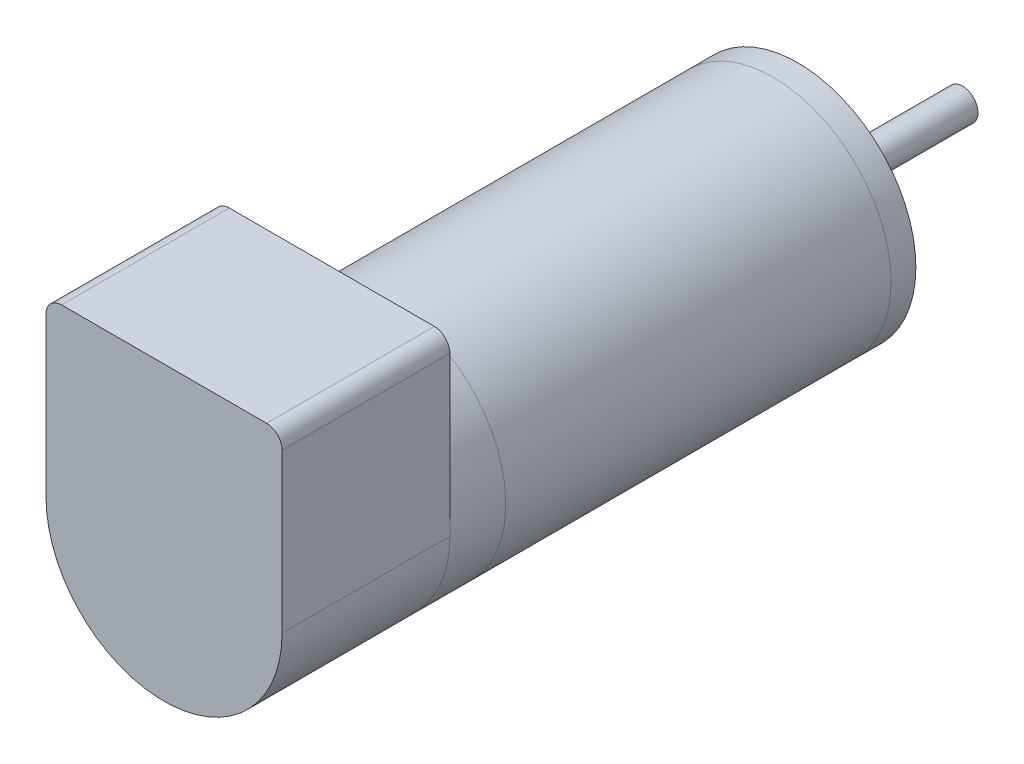
ISO-10303-21;
HEADER;
FILE_DESCRIPTION(('STEP AP214'),'2;1');
FILE_NAME('part.step','',(''),(''),'','','');
FILE_SCHEMA(('AUTOMOTIVE_DESIGN { 1 0 10303 214 1 1 1 1 }'));
ENDSEC;
DATA;
#1=APPLICATION_CONTEXT('core data for automotive mechanical design processes');
#2=APPLICATION_PROTOCOL_DEFINITION('international standard','automotive_design',2000,#1);
#3=PRODUCT_CONTEXT('',#1,'mechanical');
#4=PRODUCT('Part','Part','',(#3));
#5=PRODUCT_RELATED_PRODUCT_CATEGORY('part','',(#4));
#6=PRODUCT_DEFINITION_FORMATION('','',#4);
#7=PRODUCT_DEFINITION_CONTEXT('part definition',#1,'design');
#8=PRODUCT_DEFINITION('design','',#6,#7);
#9=PRODUCT_DEFINITION_SHAPE('','',#8);
#10=(LENGTH_UNIT() NAMED_UNIT(*) SI_UNIT(.MILLI.,.METRE.));
#11=(NAMED_UNIT(*) PLANE_ANGLE_UNIT() SI_UNIT($,.RADIAN.));
#12=(NAMED_UNIT(*) SI_UNIT($,.STERADIAN.) SOLID_ANGLE_UNIT());
#13=UNCERTAINTY_MEASURE_WITH_UNIT(LENGTH_MEASURE(1.E-05),#10,'distance_accuracy_value','');
#14=(GEOMETRIC_REPRESENTATION_CONTEXT(3) GLOBAL_UNCERTAINTY_ASSIGNED_CONTEXT((#13)) GLOBAL_UNIT_ASSIGNED_CONTEXT((#10,
#11,#12)) REPRESENTATION_CONTEXT('',''));
#15=CARTESIAN_POINT('',(0.,0.,0.));
#16=DIRECTION('',(0.,0.,1.));
#17=DIRECTION('',(1.,0.,0.));
#18=AXIS2_PLACEMENT_3D('',#15,#16,#17);
#19=CARTESIAN_POINT('',(0.,0.,0.));
#20=DIRECTION('',(0.,0.,1.));
#21=DIRECTION('',(1.,0.,0.));
#22=AXIS2_PLACEMENT_3D('',#19,#20,#21);
#23=CYLINDRICAL_SURFACE('',#22,19.);
#24=CARTESIAN_POINT('',(0.,0.,0.));
#25=DIRECTION('',(0.,0.,1.));
#26=DIRECTION('',(1.,0.,0.));
#27=AXIS2_PLACEMENT_3D('',#24,#25,#26);
#28=CIRCLE('',#27,19.);
#29=CARTESIAN_POINT('',(19.,0.,0.));
#30=VERTEX_POINT('',#29);
#31=CARTESIAN_POINT('',(0.,19.,0.));
#32=VERTEX_POINT('',#31);
#33=EDGE_CURVE('E151',#30,#32,#28,.T.);
#34=ORIENTED_EDGE('',*,*,#33,.F.);
#35=CARTESIAN_POINT('',(0.,0.,0.));
#36=DIRECTION('',(0.,0.,-1.));
#37=DIRECTION('',(-1.,0.,0.));
#38=AXIS2_PLACEMENT_3D('',#35,#36,#37);
#39=CIRCLE('',#38,19.);
#40=CARTESIAN_POINT('',(0.,-19.,0.));
#41=VERTEX_POINT('',#40);
#42=EDGE_CURVE('E128',#30,#41,#39,.T.);
#43=ORIENTED_EDGE('',*,*,#42,.T.);
#44=CARTESIAN_POINT('',(-19.,0.,0.));
#45=VERTEX_POINT('',#44);
#46=EDGE_CURVE('E158',#41,#45,#39,.T.);
#47=ORIENTED_EDGE('',*,*,#46,.T.);
#48=EDGE_CURVE('E150',#32,#45,#28,.T.);
#49=ORIENTED_EDGE('',*,*,#48,.F.);
#50=EDGE_LOOP('',(#34,#43,#47,#49));
#51=FACE_BOUND('',#50,.T.);
#52=CARTESIAN_POINT('',(0.,0.,-9.));
#53=DIRECTION('',(0.,0.,-1.));
#54=DIRECTION('',(0.,1.,0.));
#55=AXIS2_PLACEMENT_3D('',#52,#53,#54);
#56=CIRCLE('',#55,19.);
#57=CARTESIAN_POINT('',(0.,19.,-9.));
#58=VERTEX_POINT('',#57);
#59=CARTESIAN_POINT('',(0.,-19.,-9.00000000000001));
#60=VERTEX_POINT('',#59);
#61=EDGE_CURVE('E11',#58,#60,#56,.T.);
#62=ORIENTED_EDGE('',*,*,#61,.F.);
#63=EDGE_CURVE('E42',#60,#58,#56,.T.);
#64=ORIENTED_EDGE('',*,*,#63,.F.);
#65=EDGE_LOOP('',(#62,#64));
#66=FACE_BOUND('',#65,.T.);
#67=ADVANCED_FACE('F38',(#51,#66),#23,.T.);
#68=ORIENTED_EDGE('',*,*,#42,.F.);
#69=DIRECTION('',(0.,0.,-1.));
#70=VECTOR('',#69,1.);
#71=CARTESIAN_POINT('',(19.,0.,27.));
#72=LINE('',#71,#70);
#73=CARTESIAN_POINT('',(19.,0.,27.));
#74=VERTEX_POINT('',#73);
#75=EDGE_CURVE('E109',#74,#30,#72,.T.);
#76=ORIENTED_EDGE('',*,*,#75,.F.);
#77=CARTESIAN_POINT('',(0.,0.,27.));
#78=DIRECTION('',(0.,0.,1.));
#79=DIRECTION('',(1.,0.,0.));
#80=AXIS2_PLACEMENT_3D('',#77,#78,#79);
#81=CIRCLE('',#80,19.);
#82=CARTESIAN_POINT('',(-19.,0.,27.));
#83=VERTEX_POINT('',#82);
#84=EDGE_CURVE('E115',#83,#74,#81,.T.);
#85=ORIENTED_EDGE('',*,*,#84,.F.);
#86=DIRECTION('',(0.,0.,-1.));
#87=VECTOR('',#86,1.);
#88=CARTESIAN_POINT('',(-19.,0.,27.));
#89=LINE('',#88,#87);
#90=EDGE_CURVE('E205',#83,#45,#89,.T.);
#91=ORIENTED_EDGE('',*,*,#90,.T.);
#92=ORIENTED_EDGE('',*,*,#46,.F.);
#93=EDGE_LOOP('',(#68,#76,#85,#91,#92));
#94=FACE_BOUND('',#93,.T.);
#95=ADVANCED_FACE('F126',(#94),#23,.T.);
#96=ORIENTED_EDGE('',*,*,#63,.T.);
#97=ORIENTED_EDGE('',*,*,#61,.T.);
#98=EDGE_LOOP('',(#96,#97));
#99=FACE_BOUND('',#98,.T.);
#100=CARTESIAN_POINT('',(0.,0.,-71.));
#101=DIRECTION('',(0.,0.,-1.));
#102=DIRECTION('',(-1.,0.,0.));
#103=AXIS2_PLACEMENT_3D('',#100,#101,#102);
#104=CIRCLE('',#103,19.);
#105=CARTESIAN_POINT('',(0.,19.,-71.));
#106=VERTEX_POINT('',#105);
#107=CARTESIAN_POINT('',(0.,-19.,-71.));
#108=VERTEX_POINT('',#107);
#109=EDGE_CURVE('E157',#106,#108,#104,.T.);
#110=ORIENTED_EDGE('',*,*,#109,.F.);
#111=EDGE_CURVE('E154',#108,#106,#104,.T.);
#112=ORIENTED_EDGE('',*,*,#111,.F.);
#113=EDGE_LOOP('',(#110,#112));
#114=FACE_BOUND('',#113,.T.);
#115=ADVANCED_FACE('F173',(#99,#114),#23,.T.);
#116=ORIENTED_EDGE('',*,*,#111,.T.);
#117=ORIENTED_EDGE('',*,*,#109,.T.);
#118=EDGE_LOOP('',(#116,#117));
#119=FACE_BOUND('',#118,.T.);
#120=CARTESIAN_POINT('',(0.,0.,-75.));
#121=DIRECTION('',(0.,0.,1.));
#122=DIRECTION('',(1.,0.,0.));
#123=AXIS2_PLACEMENT_3D('',#120,#121,#122);
#124=CIRCLE('',#123,19.);
#125=CARTESIAN_POINT('',(19.,0.,-75.));
#126=VERTEX_POINT('',#125);
#127=EDGE_CURVE('E147',#126,#126,#124,.T.);
#128=ORIENTED_EDGE('',*,*,#127,.T.);
#129=EDGE_LOOP('',(#128));
#130=FACE_BOUND('',#129,.T.);
#131=ADVANCED_FACE('F40',(#119,#130),#23,.T.);
#132=CARTESIAN_POINT('',(0.,19.,-75.));
#133=DIRECTION('',(0.,0.,1.));
#134=DIRECTION('',(1.,0.,0.));
#135=AXIS2_PLACEMENT_3D('',#132,#133,#134);
#136=PLANE('',#135);
#137=CARTESIAN_POINT('',(8.83883476483179,-8.83883476483189,-75.));
#138=DIRECTION('',(0.,0.,-1.));
#139=DIRECTION('',(-1.,0.,0.));
#140=AXIS2_PLACEMENT_3D('',#137,#138,#139);
#141=CIRCLE('',#140,1.50000000000011);
#142=CARTESIAN_POINT('',(7.33883476483168,-8.83883476483189,-75.));
#143=VERTEX_POINT('',#142);
#144=EDGE_CURVE('E235',#143,#143,#141,.T.);
#145=ORIENTED_EDGE('',*,*,#144,.F.);
#146=EDGE_LOOP('',(#145));
#147=FACE_BOUND('',#146,.T.);
#148=CARTESIAN_POINT('',(-8.83883476483189,-8.83883476483179,-75.));
#149=DIRECTION('',(0.,0.,-1.));
#150=DIRECTION('',(-1.,0.,0.));
#151=AXIS2_PLACEMENT_3D('',#148,#149,#150);
#152=CIRCLE('',#151,1.50000000000007);
#153=CARTESIAN_POINT('',(-10.338834764832,-8.83883476483179,-75.));
#154=VERTEX_POINT('',#153);
#155=EDGE_CURVE('E241',#154,#154,#152,.T.);
#156=ORIENTED_EDGE('',*,*,#155,.F.);
#157=EDGE_LOOP('',(#156));
#158=FACE_BOUND('',#157,.T.);
#159=CARTESIAN_POINT('',(-8.83883476483179,8.83883476483189,-75.));
#160=DIRECTION('',(0.,0.,-1.));
#161=DIRECTION('',(-1.,0.,0.));
#162=AXIS2_PLACEMENT_3D('',#159,#160,#161);
#163=CIRCLE('',#162,1.50000000000003);
#164=CARTESIAN_POINT('',(-10.3388347648318,8.83883476483189,-75.));
#165=VERTEX_POINT('',#164);
#166=EDGE_CURVE('E247',#165,#165,#163,.T.);
#167=ORIENTED_EDGE('',*,*,#166,.F.);
#168=EDGE_LOOP('',(#167));
#169=FACE_BOUND('',#168,.T.);
#170=CARTESIAN_POINT('',(8.83883476483189,8.83883476483179,-75.));
#171=DIRECTION('',(0.,0.,-1.));
#172=DIRECTION('',(-1.,0.,0.));
#173=AXIS2_PLACEMENT_3D('',#170,#171,#172);
#174=CIRCLE('',#173,1.5);
#175=CARTESIAN_POINT('',(7.3388347648319,8.83883476483179,-75.));
#176=VERTEX_POINT('',#175);
#177=EDGE_CURVE('E195',#176,#176,#174,.T.);
#178=ORIENTED_EDGE('',*,*,#177,.F.);
#179=EDGE_LOOP('',(#178));
#180=FACE_BOUND('',#179,.T.);
#181=ORIENTED_EDGE('',*,*,#127,.F.);
#182=EDGE_LOOP('',(#181));
#183=FACE_BOUND('',#182,.T.);
#184=CARTESIAN_POINT('',(0.,0.,-75.));
#185=DIRECTION('',(0.,0.,1.));
#186=DIRECTION('',(1.,0.,0.));
#187=AXIS2_PLACEMENT_3D('',#184,#185,#186);
#188=CIRCLE('',#187,6.25);
#189=CARTESIAN_POINT('',(6.25,0.,-75.));
#190=VERTEX_POINT('',#189);
#191=EDGE_CURVE('E144',#190,#190,#188,.T.);
#192=ORIENTED_EDGE('',*,*,#191,.T.);
#193=EDGE_LOOP('',(#192));
#194=FACE_BOUND('',#193,.T.);
#195=ADVANCED_FACE('F179',(#147,#158,#169,#180,#183,#194),#136,.F.);
#196=CARTESIAN_POINT('',(0.,0.,0.));
#197=DIRECTION('',(0.,0.,1.));
#198=DIRECTION('',(1.,0.,0.));
#199=AXIS2_PLACEMENT_3D('',#196,#197,#198);
#200=CYLINDRICAL_SURFACE('',#199,6.25);
#201=ORIENTED_EDGE('',*,*,#191,.F.);
#202=EDGE_LOOP('',(#201));
#203=FACE_BOUND('',#202,.T.);
#204=CARTESIAN_POINT('',(0.,0.,-76.5));
#205=DIRECTION('',(0.,0.,1.));
#206=DIRECTION('',(1.,0.,0.));
#207=AXIS2_PLACEMENT_3D('',#204,#205,#206);
#208=CIRCLE('',#207,6.25);
#209=CARTESIAN_POINT('',(6.25,0.,-76.5));
#210=VERTEX_POINT('',#209);
#211=EDGE_CURVE('E141',#210,#210,#208,.T.);
#212=ORIENTED_EDGE('',*,*,#211,.T.);
#213=EDGE_LOOP('',(#212));
#214=FACE_BOUND('',#213,.T.);
#215=ADVANCED_FACE('F264',(#203,#214),#200,.T.);
#216=CARTESIAN_POINT('',(0.,6.25,-76.5));
#217=DIRECTION('',(0.,0.,1.));
#218=DIRECTION('',(1.,0.,0.));
#219=AXIS2_PLACEMENT_3D('',#216,#217,#218);
#220=PLANE('',#219);
#221=ORIENTED_EDGE('',*,*,#211,.F.);
#222=EDGE_LOOP('',(#221));
#223=FACE_BOUND('',#222,.T.);
#224=CARTESIAN_POINT('',(0.,0.,-76.5));
#225=DIRECTION('',(0.,0.,1.));
#226=DIRECTION('',(1.,0.,0.));
#227=AXIS2_PLACEMENT_3D('',#224,#225,#226);
#228=CIRCLE('',#227,2.5);
#229=CARTESIAN_POINT('',(2.5,0.,-76.5));
#230=VERTEX_POINT('',#229);
#231=EDGE_CURVE('E133',#230,#230,#228,.T.);
#232=ORIENTED_EDGE('',*,*,#231,.T.);
#233=EDGE_LOOP('',(#232));
#234=FACE_BOUND('',#233,.T.);
#235=ADVANCED_FACE('F274',(#223,#234),#220,.F.);
#236=CARTESIAN_POINT('',(0.,0.,0.));
#237=DIRECTION('',(0.,0.,1.));
#238=DIRECTION('',(1.,0.,0.));
#239=AXIS2_PLACEMENT_3D('',#236,#237,#238);
#240=CYLINDRICAL_SURFACE('',#239,2.5);
#241=ORIENTED_EDGE('',*,*,#231,.F.);
#242=EDGE_LOOP('',(#241));
#243=FACE_BOUND('',#242,.T.);
#244=CARTESIAN_POINT('',(0.,0.,-101.5));
#245=DIRECTION('',(0.,0.,1.));
#246=DIRECTION('',(1.,0.,0.));
#247=AXIS2_PLACEMENT_3D('',#244,#245,#246);
#248=CIRCLE('',#247,2.5);
#249=CARTESIAN_POINT('',(2.5,0.,-101.5));
#250=VERTEX_POINT('',#249);
#251=EDGE_CURVE('E130',#250,#250,#248,.T.);
#252=ORIENTED_EDGE('',*,*,#251,.T.);
#253=EDGE_LOOP('',(#252));
#254=FACE_BOUND('',#253,.T.);
#255=ADVANCED_FACE('F280',(#243,#254),#240,.T.);
#256=CARTESIAN_POINT('',(0.,2.5,-101.5));
#257=DIRECTION('',(0.,0.,1.));
#258=DIRECTION('',(1.,0.,0.));
#259=AXIS2_PLACEMENT_3D('',#256,#257,#258);
#260=PLANE('',#259);
#261=ORIENTED_EDGE('',*,*,#251,.F.);
#262=EDGE_LOOP('',(#261));
#263=FACE_BOUND('',#262,.T.);
#264=ADVANCED_FACE('F286',(#263),#260,.F.);
#265=CARTESIAN_POINT('',(0.,0.,0.));
#266=DIRECTION('',(0.,0.,1.));
#267=DIRECTION('',(1.,0.,0.));
#268=AXIS2_PLACEMENT_3D('',#265,#266,#267);
#269=PLANE('',#268);
#270=DIRECTION('',(0.,1.,0.));
#271=VECTOR('',#270,1.);
#272=CARTESIAN_POINT('',(19.,25.5,0.));
#273=LINE('',#272,#271);
#274=CARTESIAN_POINT('',(19.,25.5,0.));
#275=VERTEX_POINT('',#274);
#276=EDGE_CURVE('E186',#30,#275,#273,.T.);
#277=ORIENTED_EDGE('',*,*,#276,.F.);
#278=ORIENTED_EDGE('',*,*,#33,.T.);
#279=ORIENTED_EDGE('',*,*,#48,.T.);
#280=DIRECTION('',(0.,-1.,0.));
#281=VECTOR('',#280,1.);
#282=CARTESIAN_POINT('',(-19.,0.,0.));
#283=LINE('',#282,#281);
#284=CARTESIAN_POINT('',(-19.,25.5,0.));
#285=VERTEX_POINT('',#284);
#286=EDGE_CURVE('E124',#285,#45,#283,.T.);
#287=ORIENTED_EDGE('',*,*,#286,.F.);
#288=CARTESIAN_POINT('',(-16.5,25.5,0.));
#289=DIRECTION('',(0.,0.,1.));
#290=DIRECTION('',(-1.,0.,0.));
#291=AXIS2_PLACEMENT_3D('',#288,#289,#290);
#292=CIRCLE('',#291,2.5);
#293=CARTESIAN_POINT('',(-16.5,28.,0.));
#294=VERTEX_POINT('',#293);
#295=EDGE_CURVE('E201',#294,#285,#292,.T.);
#296=ORIENTED_EDGE('',*,*,#295,.F.);
#297=DIRECTION('',(-1.,0.,0.));
#298=VECTOR('',#297,1.);
#299=CARTESIAN_POINT('',(-16.5,28.,0.));
#300=LINE('',#299,#298);
#301=CARTESIAN_POINT('',(16.5,28.,0.));
#302=VERTEX_POINT('',#301);
#303=EDGE_CURVE('E192',#302,#294,#300,.T.);
#304=ORIENTED_EDGE('',*,*,#303,.F.);
#305=CARTESIAN_POINT('',(16.5,25.5,0.));
#306=DIRECTION('',(0.,0.,1.));
#307=DIRECTION('',(1.,0.,0.));
#308=AXIS2_PLACEMENT_3D('',#305,#306,#307);
#309=CIRCLE('',#308,2.5);
#310=EDGE_CURVE('E189',#275,#302,#309,.T.);
#311=ORIENTED_EDGE('',*,*,#310,.F.);
#312=EDGE_LOOP('',(#277,#278,#279,#287,#296,#304,#311));
#313=FACE_BOUND('',#312,.T.);
#314=ADVANCED_FACE('F187',(#313),#269,.F.);
#315=CARTESIAN_POINT('',(19.,25.5,27.));
#316=DIRECTION('',(-1.,0.,0.));
#317=DIRECTION('',(0.,0.,1.));
#318=AXIS2_PLACEMENT_3D('',#315,#316,#317);
#319=PLANE('',#318);
#320=ORIENTED_EDGE('',*,*,#276,.T.);
#321=DIRECTION('',(0.,0.,-1.));
#322=VECTOR('',#321,1.);
#323=CARTESIAN_POINT('',(19.,25.5,27.));
#324=LINE('',#323,#322);
#325=CARTESIAN_POINT('',(19.,25.5,27.));
#326=VERTEX_POINT('',#325);
#327=EDGE_CURVE('E111',#326,#275,#324,.T.);
#328=ORIENTED_EDGE('',*,*,#327,.F.);
#329=DIRECTION('',(0.,1.,0.));
#330=VECTOR('',#329,1.);
#331=CARTESIAN_POINT('',(19.,25.5,27.));
#332=LINE('',#331,#330);
#333=EDGE_CURVE('E105',#74,#326,#332,.T.);
#334=ORIENTED_EDGE('',*,*,#333,.F.);
#335=ORIENTED_EDGE('',*,*,#75,.T.);
#336=EDGE_LOOP('',(#320,#328,#334,#335));
#337=FACE_BOUND('',#336,.T.);
#338=ADVANCED_FACE('F107',(#337),#319,.F.);
#339=CARTESIAN_POINT('',(16.5,25.5,27.));
#340=DIRECTION('',(0.,0.,-1.));
#341=DIRECTION('',(-1.,0.,0.));
#342=AXIS2_PLACEMENT_3D('',#339,#340,#341);
#343=CYLINDRICAL_SURFACE('',#342,2.5);
#344=ORIENTED_EDGE('',*,*,#310,.T.);
#345=DIRECTION('',(0.,0.,-1.));
#346=VECTOR('',#345,1.);
#347=CARTESIAN_POINT('',(16.5,28.,27.));
#348=LINE('',#347,#346);
#349=CARTESIAN_POINT('',(16.5,28.,27.));
#350=VERTEX_POINT('',#349);
#351=EDGE_CURVE('E135',#350,#302,#348,.T.);
#352=ORIENTED_EDGE('',*,*,#351,.F.);
#353=CARTESIAN_POINT('',(16.5,25.5,27.));
#354=DIRECTION('',(0.,0.,1.));
#355=DIRECTION('',(1.,0.,0.));
#356=AXIS2_PLACEMENT_3D('',#353,#354,#355);
#357=CIRCLE('',#356,2.5);
#358=EDGE_CURVE('E114',#326,#350,#357,.T.);
#359=ORIENTED_EDGE('',*,*,#358,.F.);
#360=ORIENTED_EDGE('',*,*,#327,.T.);
#361=EDGE_LOOP('',(#344,#352,#359,#360));
#362=FACE_BOUND('',#361,.T.);
#363=ADVANCED_FACE('F299',(#362),#343,.T.);
#364=CARTESIAN_POINT('',(-16.5,28.,27.));
#365=DIRECTION('',(0.,-1.,0.));
#366=DIRECTION('',(0.,0.,-1.));
#367=AXIS2_PLACEMENT_3D('',#364,#365,#366);
#368=PLANE('',#367);
#369=ORIENTED_EDGE('',*,*,#303,.T.);
#370=DIRECTION('',(0.,0.,-1.));
#371=VECTOR('',#370,1.);
#372=CARTESIAN_POINT('',(-16.5,28.,27.));
#373=LINE('',#372,#371);
#374=CARTESIAN_POINT('',(-16.5,28.,27.));
#375=VERTEX_POINT('',#374);
#376=EDGE_CURVE('E210',#375,#294,#373,.T.);
#377=ORIENTED_EDGE('',*,*,#376,.F.);
#378=DIRECTION('',(-1.,0.,0.));
#379=VECTOR('',#378,1.);
#380=CARTESIAN_POINT('',(-16.5,28.,27.));
#381=LINE('',#380,#379);
#382=EDGE_CURVE('E218',#350,#375,#381,.T.);
#383=ORIENTED_EDGE('',*,*,#382,.F.);
#384=ORIENTED_EDGE('',*,*,#351,.T.);
#385=EDGE_LOOP('',(#369,#377,#383,#384));
#386=FACE_BOUND('',#385,.T.);
#387=ADVANCED_FACE('F216',(#386),#368,.F.);
#388=CARTESIAN_POINT('',(-16.5,25.5,27.));
#389=DIRECTION('',(0.,0.,-1.));
#390=DIRECTION('',(-1.,0.,0.));
#391=AXIS2_PLACEMENT_3D('',#388,#389,#390);
#392=CYLINDRICAL_SURFACE('',#391,2.5);
#393=ORIENTED_EDGE('',*,*,#295,.T.);
#394=DIRECTION('',(0.,0.,-1.));
#395=VECTOR('',#394,1.);
#396=CARTESIAN_POINT('',(-19.,25.5,27.));
#397=LINE('',#396,#395);
#398=CARTESIAN_POINT('',(-19.,25.5,27.));
#399=VERTEX_POINT('',#398);
#400=EDGE_CURVE('E207',#399,#285,#397,.T.);
#401=ORIENTED_EDGE('',*,*,#400,.F.);
#402=CARTESIAN_POINT('',(-16.5,25.5,27.));
#403=DIRECTION('',(0.,0.,1.));
#404=DIRECTION('',(-1.,0.,0.));
#405=AXIS2_PLACEMENT_3D('',#402,#403,#404);
#406=CIRCLE('',#405,2.5);
#407=EDGE_CURVE('E228',#375,#399,#406,.T.);
#408=ORIENTED_EDGE('',*,*,#407,.F.);
#409=ORIENTED_EDGE('',*,*,#376,.T.);
#410=EDGE_LOOP('',(#393,#401,#408,#409));
#411=FACE_BOUND('',#410,.T.);
#412=ADVANCED_FACE('F224',(#411),#392,.T.);
#413=CARTESIAN_POINT('',(-19.,0.,27.));
#414=DIRECTION('',(1.,0.,0.));
#415=DIRECTION('',(0.,0.,-1.));
#416=AXIS2_PLACEMENT_3D('',#413,#414,#415);
#417=PLANE('',#416);
#418=ORIENTED_EDGE('',*,*,#286,.T.);
#419=ORIENTED_EDGE('',*,*,#90,.F.);
#420=DIRECTION('',(0.,-1.,0.));
#421=VECTOR('',#420,1.);
#422=CARTESIAN_POINT('',(-19.,0.,27.));
#423=LINE('',#422,#421);
#424=EDGE_CURVE('E120',#399,#83,#423,.T.);
#425=ORIENTED_EDGE('',*,*,#424,.F.);
#426=ORIENTED_EDGE('',*,*,#400,.T.);
#427=EDGE_LOOP('',(#418,#419,#425,#426));
#428=FACE_BOUND('',#427,.T.);
#429=ADVANCED_FACE('F227',(#428),#417,.F.);
#430=CARTESIAN_POINT('',(0.,0.,27.));
#431=DIRECTION('',(0.,0.,1.));
#432=DIRECTION('',(1.,0.,0.));
#433=AXIS2_PLACEMENT_3D('',#430,#431,#432);
#434=PLANE('',#433);
#435=ORIENTED_EDGE('',*,*,#84,.T.);
#436=ORIENTED_EDGE('',*,*,#333,.T.);
#437=ORIENTED_EDGE('',*,*,#358,.T.);
#438=ORIENTED_EDGE('',*,*,#382,.T.);
#439=ORIENTED_EDGE('',*,*,#407,.T.);
#440=ORIENTED_EDGE('',*,*,#424,.T.);
#441=EDGE_LOOP('',(#435,#436,#437,#438,#439,#440));
#442=FACE_BOUND('',#441,.T.);
#443=ADVANCED_FACE('F118',(#442),#434,.T.);
#444=CARTESIAN_POINT('',(8.83883476483189,8.83883476483179,-65.));
#445=DIRECTION('',(0.,0.,-1.));
#446=DIRECTION('',(-1.,0.,0.));
#447=AXIS2_PLACEMENT_3D('',#444,#445,#446);
#448=CYLINDRICAL_SURFACE('',#447,1.5);
#449=CARTESIAN_POINT('',(8.83883476483189,8.83883476483179,-65.));
#450=DIRECTION('',(0.,0.,-1.));
#451=DIRECTION('',(-1.,0.,0.));
#452=AXIS2_PLACEMENT_3D('',#449,#450,#451);
#453=CIRCLE('',#452,1.5);
#454=CARTESIAN_POINT('',(7.3388347648319,8.83883476483179,-65.));
#455=VERTEX_POINT('',#454);
#456=EDGE_CURVE('E190',#455,#455,#453,.T.);
#457=ORIENTED_EDGE('',*,*,#456,.F.);
#458=EDGE_LOOP('',(#457));
#459=FACE_BOUND('',#458,.T.);
#460=ORIENTED_EDGE('',*,*,#177,.T.);
#461=EDGE_LOOP('',(#460));
#462=FACE_BOUND('',#461,.T.);
#463=ADVANCED_FACE('F310',(#459,#462),#448,.F.);
#464=CARTESIAN_POINT('',(8.83883476483189,8.83883476483179,-65.));
#465=DIRECTION('',(0.,0.,-1.));
#466=DIRECTION('',(-1.,0.,0.));
#467=AXIS2_PLACEMENT_3D('',#464,#465,#466);
#468=PLANE('',#467);
#469=ORIENTED_EDGE('',*,*,#456,.T.);
#470=EDGE_LOOP('',(#469));
#471=FACE_BOUND('',#470,.T.);
#472=ADVANCED_FACE('F258',(#471),#468,.T.);
#473=CARTESIAN_POINT('',(-8.83883476483179,8.83883476483189,-65.));
#474=DIRECTION('',(0.,0.,-1.));
#475=DIRECTION('',(-1.,0.,0.));
#476=AXIS2_PLACEMENT_3D('',#473,#474,#475);
#477=CYLINDRICAL_SURFACE('',#476,1.50000000000003);
#478=CARTESIAN_POINT('',(-8.83883476483179,8.83883476483189,-65.));
#479=DIRECTION('',(0.,0.,-1.));
#480=DIRECTION('',(-1.,0.,0.));
#481=AXIS2_PLACEMENT_3D('',#478,#479,#480);
#482=CIRCLE('',#481,1.50000000000003);
#483=CARTESIAN_POINT('',(-10.3388347648318,8.83883476483189,-65.));
#484=VERTEX_POINT('',#483);
#485=EDGE_CURVE('E233',#484,#484,#482,.T.);
#486=ORIENTED_EDGE('',*,*,#485,.F.);
#487=EDGE_LOOP('',(#486));
#488=FACE_BOUND('',#487,.T.);
#489=ORIENTED_EDGE('',*,*,#166,.T.);
#490=EDGE_LOOP('',(#489));
#491=FACE_BOUND('',#490,.T.);
#492=ADVANCED_FACE('F255',(#488,#491),#477,.F.);
#493=CARTESIAN_POINT('',(-8.83883476483179,8.83883476483189,-65.));
#494=DIRECTION('',(0.,0.,-1.));
#495=DIRECTION('',(-1.,0.,0.));
#496=AXIS2_PLACEMENT_3D('',#493,#494,#495);
#497=PLANE('',#496);
#498=ORIENTED_EDGE('',*,*,#485,.T.);
#499=EDGE_LOOP('',(#498));
#500=FACE_BOUND('',#499,.T.);
#501=ADVANCED_FACE('F253',(#500),#497,.T.);
#502=CARTESIAN_POINT('',(-8.83883476483189,-8.83883476483179,-65.));
#503=DIRECTION('',(0.,0.,-1.));
#504=DIRECTION('',(-1.,0.,0.));
#505=AXIS2_PLACEMENT_3D('',#502,#503,#504);
#506=CYLINDRICAL_SURFACE('',#505,1.50000000000007);
#507=CARTESIAN_POINT('',(-8.83883476483189,-8.83883476483179,-65.));
#508=DIRECTION('',(0.,0.,-1.));
#509=DIRECTION('',(-1.,0.,0.));
#510=AXIS2_PLACEMENT_3D('',#507,#508,#509);
#511=CIRCLE('',#510,1.50000000000007);
#512=CARTESIAN_POINT('',(-10.338834764832,-8.83883476483179,-65.));
#513=VERTEX_POINT('',#512);
#514=EDGE_CURVE('E244',#513,#513,#511,.T.);
#515=ORIENTED_EDGE('',*,*,#514,.F.);
#516=EDGE_LOOP('',(#515));
#517=FACE_BOUND('',#516,.T.);
#518=ORIENTED_EDGE('',*,*,#155,.T.);
#519=EDGE_LOOP('',(#518));
#520=FACE_BOUND('',#519,.T.);
#521=ADVANCED_FACE('F326',(#517,#520),#506,.F.);
#522=CARTESIAN_POINT('',(-8.83883476483189,-8.83883476483179,-65.));
#523=DIRECTION('',(0.,0.,-1.));
#524=DIRECTION('',(-1.,0.,0.));
#525=AXIS2_PLACEMENT_3D('',#522,#523,#524);
#526=PLANE('',#525);
#527=ORIENTED_EDGE('',*,*,#514,.T.);
#528=EDGE_LOOP('',(#527));
#529=FACE_BOUND('',#528,.T.);
#530=ADVANCED_FACE('F321',(#529),#526,.T.);
#531=CARTESIAN_POINT('',(8.83883476483179,-8.83883476483189,-65.));
#532=DIRECTION('',(0.,0.,-1.));
#533=DIRECTION('',(-1.,0.,0.));
#534=AXIS2_PLACEMENT_3D('',#531,#532,#533);
#535=CYLINDRICAL_SURFACE('',#534,1.50000000000011);
#536=CARTESIAN_POINT('',(8.83883476483179,-8.83883476483189,-65.));
#537=DIRECTION('',(0.,0.,-1.));
#538=DIRECTION('',(-1.,0.,0.));
#539=AXIS2_PLACEMENT_3D('',#536,#537,#538);
#540=CIRCLE('',#539,1.50000000000011);
#541=CARTESIAN_POINT('',(7.33883476483168,-8.83883476483189,-65.));
#542=VERTEX_POINT('',#541);
#543=EDGE_CURVE('E238',#542,#542,#540,.T.);
#544=ORIENTED_EDGE('',*,*,#543,.F.);
#545=EDGE_LOOP('',(#544));
#546=FACE_BOUND('',#545,.T.);
#547=ORIENTED_EDGE('',*,*,#144,.T.);
#548=EDGE_LOOP('',(#547));
#549=FACE_BOUND('',#548,.T.);
#550=ADVANCED_FACE('F317',(#546,#549),#535,.F.);
#551=CARTESIAN_POINT('',(8.83883476483179,-8.83883476483189,-65.));
#552=DIRECTION('',(0.,0.,-1.));
#553=DIRECTION('',(-1.,0.,0.));
#554=AXIS2_PLACEMENT_3D('',#551,#552,#553);
#555=PLANE('',#554);
#556=ORIENTED_EDGE('',*,*,#543,.T.);
#557=EDGE_LOOP('',(#556));
#558=FACE_BOUND('',#557,.T.);
#559=ADVANCED_FACE('F320',(#558),#555,.T.);
#560=CLOSED_SHELL('',(#67,#95,#115,#131,#195,#215,#235,#255,#264,#314,#338,#363,#387,#412,#429,
#443,#463,#472,#492,#501,#521,#530,#550,#559));
#561=MANIFOLD_SOLID_BREP('B2',#560);
#562=ADVANCED_BREP_SHAPE_REPRESENTATION('',(#18,#561),#14);
#563=SHAPE_DEFINITION_REPRESENTATION(#9,#562);
ENDSEC;
END-ISO-10303-21;
